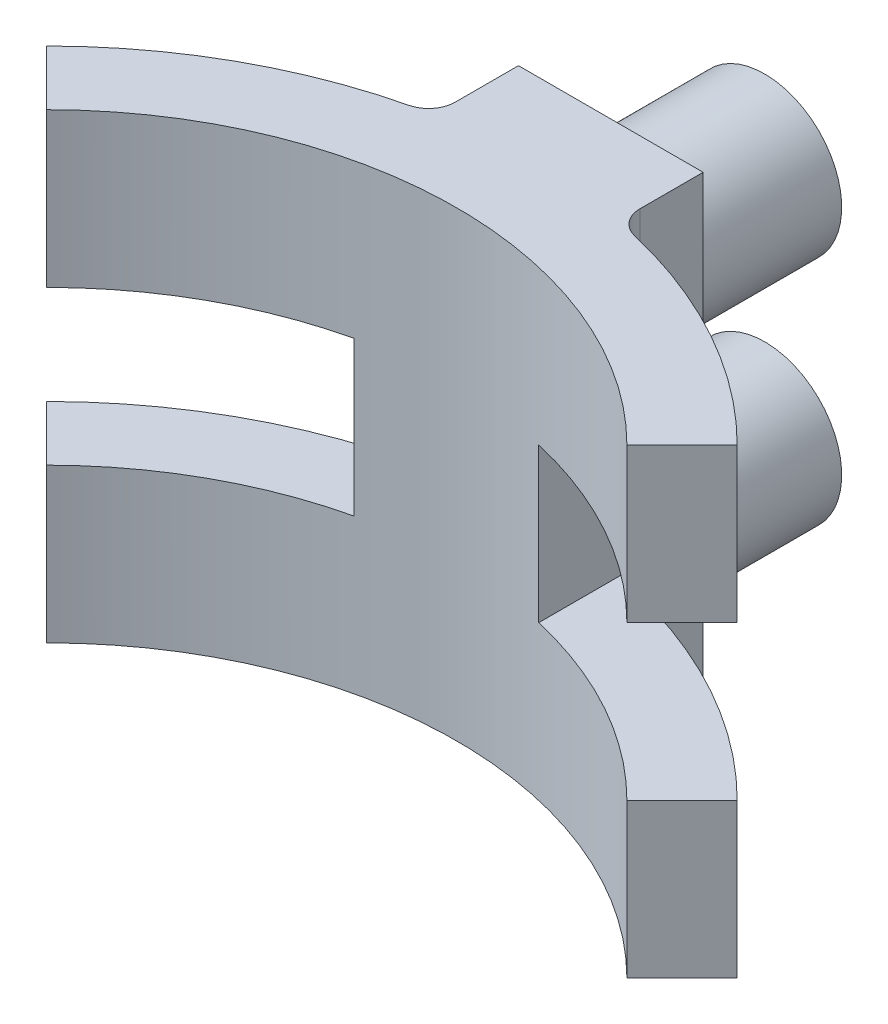
ISO-10303-21;
HEADER;
FILE_DESCRIPTION(('STEP AP214'),'2;1');
FILE_NAME('part.step','',(''),(''),'','','');
FILE_SCHEMA(('AUTOMOTIVE_DESIGN { 1 0 10303 214 1 1 1 1 }'));
ENDSEC;
DATA;
#1=APPLICATION_CONTEXT('core data for automotive mechanical design processes');
#2=APPLICATION_PROTOCOL_DEFINITION('international standard','automotive_design',2000,#1);
#3=PRODUCT_CONTEXT('',#1,'mechanical');
#4=PRODUCT('Part','Part','',(#3));
#5=PRODUCT_RELATED_PRODUCT_CATEGORY('part','',(#4));
#6=PRODUCT_DEFINITION_FORMATION('','',#4);
#7=PRODUCT_DEFINITION_CONTEXT('part definition',#1,'design');
#8=PRODUCT_DEFINITION('design','',#6,#7);
#9=PRODUCT_DEFINITION_SHAPE('','',#8);
#10=(LENGTH_UNIT() NAMED_UNIT(*) SI_UNIT(.MILLI.,.METRE.));
#11=(NAMED_UNIT(*) PLANE_ANGLE_UNIT() SI_UNIT($,.RADIAN.));
#12=(NAMED_UNIT(*) SI_UNIT($,.STERADIAN.) SOLID_ANGLE_UNIT());
#13=UNCERTAINTY_MEASURE_WITH_UNIT(LENGTH_MEASURE(1.E-05),#10,'distance_accuracy_value','');
#14=(GEOMETRIC_REPRESENTATION_CONTEXT(3) GLOBAL_UNCERTAINTY_ASSIGNED_CONTEXT((#13)) GLOBAL_UNIT_ASSIGNED_CONTEXT((#10,
#11,#12)) REPRESENTATION_CONTEXT('',''));
#15=CARTESIAN_POINT('',(0.,0.,0.));
#16=DIRECTION('',(0.,0.,1.));
#17=DIRECTION('',(1.,0.,0.));
#18=AXIS2_PLACEMENT_3D('',#15,#16,#17);
#19=CARTESIAN_POINT('',(0.,75.,0.));
#20=DIRECTION('',(0.,1.,0.));
#21=DIRECTION('',(0.,0.,1.));
#22=AXIS2_PLACEMENT_3D('',#19,#20,#21);
#23=PLANE('',#22);
#24=CARTESIAN_POINT('',(0.,75.,0.));
#25=DIRECTION('',(0.,1.,0.));
#26=DIRECTION('',(0.,0.,1.));
#27=AXIS2_PLACEMENT_3D('',#24,#25,#26);
#28=CIRCLE('',#27,200.);
#29=CARTESIAN_POINT('',(-45.,75.,-194.871752699051));
#30=VERTEX_POINT('',#29);
#31=CARTESIAN_POINT('',(-141.42135623731,75.,-141.421356237309));
#32=VERTEX_POINT('',#31);
#33=EDGE_CURVE('E313',#30,#32,#28,.T.);
#34=ORIENTED_EDGE('',*,*,#33,.F.);
#35=DIRECTION('',(0.,0.,-1.));
#36=VECTOR('',#35,1.);
#37=CARTESIAN_POINT('',(-45.,75.,-141.420356237309));
#38=LINE('',#37,#36);
#39=CARTESIAN_POINT('',(-45.,75.,-244.206879509976));
#40=VERTEX_POINT('',#39);
#41=EDGE_CURVE('E287',#30,#40,#38,.T.);
#42=ORIENTED_EDGE('',*,*,#41,.T.);
#43=CARTESIAN_POINT('',(-58.,75.,-244.206879509976));
#44=DIRECTION('',(0.,1.,0.));
#45=DIRECTION('',(0.,0.,1.));
#46=AXIS2_PLACEMENT_3D('',#43,#44,#45);
#47=CIRCLE('',#46,13.);
#48=CARTESIAN_POINT('',(-54.996015936255,75.,-231.558714435754));
#49=VERTEX_POINT('',#48);
#50=EDGE_CURVE('E302',#40,#49,#47,.F.);
#51=ORIENTED_EDGE('',*,*,#50,.T.);
#52=CARTESIAN_POINT('',(0.,75.,0.));
#53=DIRECTION('',(0.,1.,0.));
#54=DIRECTION('',(0.,0.,1.));
#55=AXIS2_PLACEMENT_3D('',#52,#53,#54);
#56=CIRCLE('',#55,238.);
#57=CARTESIAN_POINT('',(-168.291413922399,75.,-168.291413922398));
#58=VERTEX_POINT('',#57);
#59=EDGE_CURVE('E306',#49,#58,#56,.T.);
#60=ORIENTED_EDGE('',*,*,#59,.T.);
#61=DIRECTION('',(-0.707106781186549,0.,-0.707106781186546));
#62=VECTOR('',#61,1.);
#63=CARTESIAN_POINT('',(1.17756934401283E-13,75.,-1.17756934401283E-13));
#64=LINE('',#63,#62);
#65=EDGE_CURVE('E309',#32,#58,#64,.T.);
#66=ORIENTED_EDGE('',*,*,#65,.F.);
#67=EDGE_LOOP('',(#34,#42,#51,#60,#66));
#68=FACE_BOUND('',#67,.T.);
#69=ADVANCED_FACE('F38',(#68),#23,.T.);
#70=CARTESIAN_POINT('',(58.,75.,-244.206879509976));
#71=DIRECTION('',(0.,-1.,0.));
#72=DIRECTION('',(0.,0.,-1.));
#73=AXIS2_PLACEMENT_3D('',#70,#71,#72);
#74=CYLINDRICAL_SURFACE('',#73,13.);
#75=CARTESIAN_POINT('',(58.,0.,-244.206879509976));
#76=DIRECTION('',(0.,1.,0.));
#77=DIRECTION('',(0.,0.,1.));
#78=AXIS2_PLACEMENT_3D('',#75,#76,#77);
#79=CIRCLE('',#78,13.);
#80=CARTESIAN_POINT('',(45.,0.,-244.206879509976));
#81=VERTEX_POINT('',#80);
#82=CARTESIAN_POINT('',(54.996015936255,0.,-231.558714435754));
#83=VERTEX_POINT('',#82);
#84=EDGE_CURVE('E297',#81,#83,#79,.T.);
#85=ORIENTED_EDGE('',*,*,#84,.F.);
#86=DIRECTION('',(0.,-1.,0.));
#87=VECTOR('',#86,1.);
#88=CARTESIAN_POINT('',(45.,75.,-244.206879509976));
#89=LINE('',#88,#87);
#90=CARTESIAN_POINT('',(45.,75.,-244.206879509976));
#91=VERTEX_POINT('',#90);
#92=EDGE_CURVE('E11',#91,#81,#89,.T.);
#93=ORIENTED_EDGE('',*,*,#92,.F.);
#94=CARTESIAN_POINT('',(58.,75.,-244.206879509976));
#95=DIRECTION('',(0.,1.,0.));
#96=DIRECTION('',(0.,0.,1.));
#97=AXIS2_PLACEMENT_3D('',#94,#95,#96);
#98=CIRCLE('',#97,13.);
#99=CARTESIAN_POINT('',(54.996015936255,75.,-231.558714435754));
#100=VERTEX_POINT('',#99);
#101=EDGE_CURVE('E298',#91,#100,#98,.T.);
#102=ORIENTED_EDGE('',*,*,#101,.T.);
#103=DIRECTION('',(0.,-1.,0.));
#104=VECTOR('',#103,1.);
#105=CARTESIAN_POINT('',(54.996015936255,75.,-231.558714435754));
#106=LINE('',#105,#104);
#107=EDGE_CURVE('E324',#100,#83,#106,.T.);
#108=ORIENTED_EDGE('',*,*,#107,.T.);
#109=EDGE_LOOP('',(#85,#93,#102,#108));
#110=FACE_BOUND('',#109,.T.);
#111=ADVANCED_FACE('F40',(#110),#74,.F.);
#112=CARTESIAN_POINT('',(45.,75.,0.));
#113=DIRECTION('',(-1.,0.,0.));
#114=DIRECTION('',(0.,0.,1.));
#115=AXIS2_PLACEMENT_3D('',#112,#113,#114);
#116=PLANE('',#115);
#117=DIRECTION('',(0.,0.,-1.));
#118=VECTOR('',#117,1.);
#119=CARTESIAN_POINT('',(45.,0.,0.));
#120=LINE('',#119,#118);
#121=CARTESIAN_POINT('',(45.,0.,-275.));
#122=VERTEX_POINT('',#121);
#123=EDGE_CURVE('E328',#81,#122,#120,.T.);
#124=ORIENTED_EDGE('',*,*,#123,.T.);
#125=DIRECTION('',(0.,-1.,0.));
#126=VECTOR('',#125,1.);
#127=CARTESIAN_POINT('',(45.,75.,-275.));
#128=LINE('',#127,#126);
#129=CARTESIAN_POINT('',(45.,225.,-275.));
#130=VERTEX_POINT('',#129);
#131=EDGE_CURVE('E47',#130,#122,#128,.T.);
#132=ORIENTED_EDGE('',*,*,#131,.F.);
#133=DIRECTION('',(0.,0.,-1.));
#134=VECTOR('',#133,1.);
#135=CARTESIAN_POINT('',(45.,225.,-244.206879509976));
#136=LINE('',#135,#134);
#137=CARTESIAN_POINT('',(45.,225.,-244.206879509976));
#138=VERTEX_POINT('',#137);
#139=EDGE_CURVE('E238',#138,#130,#136,.T.);
#140=ORIENTED_EDGE('',*,*,#139,.F.);
#141=DIRECTION('',(0.,1.,0.));
#142=VECTOR('',#141,1.);
#143=CARTESIAN_POINT('',(45.,150.,-244.206879509976));
#144=LINE('',#143,#142);
#145=CARTESIAN_POINT('',(45.,150.,-244.206879509976));
#146=VERTEX_POINT('',#145);
#147=EDGE_CURVE('E276',#146,#138,#144,.T.);
#148=ORIENTED_EDGE('',*,*,#147,.F.);
#149=DIRECTION('',(0.,0.,-1.));
#150=VECTOR('',#149,1.);
#151=CARTESIAN_POINT('',(45.,150.,-141.420356237309));
#152=LINE('',#151,#150);
#153=CARTESIAN_POINT('',(45.,150.,-194.871752699051));
#154=VERTEX_POINT('',#153);
#155=EDGE_CURVE('E54',#154,#146,#152,.T.);
#156=ORIENTED_EDGE('',*,*,#155,.F.);
#157=DIRECTION('',(0.,1.,0.));
#158=VECTOR('',#157,1.);
#159=CARTESIAN_POINT('',(45.,150.,-194.871752699051));
#160=LINE('',#159,#158);
#161=CARTESIAN_POINT('',(45.,75.,-194.871752699051));
#162=VERTEX_POINT('',#161);
#163=EDGE_CURVE('E284',#162,#154,#160,.T.);
#164=ORIENTED_EDGE('',*,*,#163,.F.);
#165=DIRECTION('',(0.,0.,-1.));
#166=VECTOR('',#165,1.);
#167=CARTESIAN_POINT('',(45.,75.,-141.420356237309));
#168=LINE('',#167,#166);
#169=EDGE_CURVE('E290',#162,#91,#168,.T.);
#170=ORIENTED_EDGE('',*,*,#169,.T.);
#171=ORIENTED_EDGE('',*,*,#92,.T.);
#172=EDGE_LOOP('',(#124,#132,#140,#148,#156,#164,#170,#171));
#173=FACE_BOUND('',#172,.T.);
#174=ADVANCED_FACE('F394',(#173),#116,.F.);
#175=CARTESIAN_POINT('',(0.,75.,-275.));
#176=DIRECTION('',(0.,0.,-1.));
#177=DIRECTION('',(-1.,0.,0.));
#178=AXIS2_PLACEMENT_3D('',#175,#176,#177);
#179=PLANE('',#178);
#180=CARTESIAN_POINT('',(0.,56.,-275.));
#181=DIRECTION('',(0.,0.,-1.));
#182=DIRECTION('',(-1.,0.,0.));
#183=AXIS2_PLACEMENT_3D('',#180,#181,#182);
#184=CIRCLE('',#183,37.5);
#185=CARTESIAN_POINT('',(-37.5,56.,-275.));
#186=VERTEX_POINT('',#185);
#187=EDGE_CURVE('E818',#186,#186,#184,.T.);
#188=ORIENTED_EDGE('',*,*,#187,.F.);
#189=EDGE_LOOP('',(#188));
#190=FACE_BOUND('',#189,.T.);
#191=CARTESIAN_POINT('',(0.,169.,-275.));
#192=DIRECTION('',(0.,0.,-1.));
#193=DIRECTION('',(-1.,0.,0.));
#194=AXIS2_PLACEMENT_3D('',#191,#192,#193);
#195=CIRCLE('',#194,37.5);
#196=CARTESIAN_POINT('',(-37.5,169.,-275.));
#197=VERTEX_POINT('',#196);
#198=EDGE_CURVE('E209',#197,#197,#195,.T.);
#199=ORIENTED_EDGE('',*,*,#198,.F.);
#200=EDGE_LOOP('',(#199));
#201=FACE_BOUND('',#200,.T.);
#202=DIRECTION('',(1.,0.,0.));
#203=VECTOR('',#202,1.);
#204=CARTESIAN_POINT('',(0.,0.,-275.));
#205=LINE('',#204,#203);
#206=CARTESIAN_POINT('',(-45.,0.,-275.));
#207=VERTEX_POINT('',#206);
#208=EDGE_CURVE('E332',#207,#122,#205,.T.);
#209=ORIENTED_EDGE('',*,*,#208,.F.);
#210=DIRECTION('',(0.,-1.,0.));
#211=VECTOR('',#210,1.);
#212=CARTESIAN_POINT('',(-45.,75.,-275.));
#213=LINE('',#212,#211);
#214=CARTESIAN_POINT('',(-45.,225.,-275.));
#215=VERTEX_POINT('',#214);
#216=EDGE_CURVE('E383',#215,#207,#213,.T.);
#217=ORIENTED_EDGE('',*,*,#216,.F.);
#218=DIRECTION('',(1.,0.,0.));
#219=VECTOR('',#218,1.);
#220=CARTESIAN_POINT('',(-45.,225.,-275.));
#221=LINE('',#220,#219);
#222=EDGE_CURVE('E242',#215,#130,#221,.T.);
#223=ORIENTED_EDGE('',*,*,#222,.T.);
#224=ORIENTED_EDGE('',*,*,#131,.T.);
#225=EDGE_LOOP('',(#209,#217,#223,#224));
#226=FACE_BOUND('',#225,.T.);
#227=ADVANCED_FACE('F389',(#190,#201,#226),#179,.T.);
#228=CARTESIAN_POINT('',(-45.,75.,0.));
#229=DIRECTION('',(-1.,0.,0.));
#230=DIRECTION('',(0.,0.,1.));
#231=AXIS2_PLACEMENT_3D('',#228,#229,#230);
#232=PLANE('',#231);
#233=DIRECTION('',(0.,0.,-1.));
#234=VECTOR('',#233,1.);
#235=CARTESIAN_POINT('',(-45.,0.,0.));
#236=LINE('',#235,#234);
#237=CARTESIAN_POINT('',(-45.,0.,-244.206879509976));
#238=VERTEX_POINT('',#237);
#239=EDGE_CURVE('E336',#238,#207,#236,.T.);
#240=ORIENTED_EDGE('',*,*,#239,.F.);
#241=DIRECTION('',(0.,-1.,0.));
#242=VECTOR('',#241,1.);
#243=CARTESIAN_POINT('',(-45.,75.,-244.206879509976));
#244=LINE('',#243,#242);
#245=EDGE_CURVE('E380',#40,#238,#244,.T.);
#246=ORIENTED_EDGE('',*,*,#245,.F.);
#247=ORIENTED_EDGE('',*,*,#41,.F.);
#248=DIRECTION('',(0.,1.,0.));
#249=VECTOR('',#248,1.);
#250=CARTESIAN_POINT('',(-45.,150.,-194.871752699051));
#251=LINE('',#250,#249);
#252=CARTESIAN_POINT('',(-45.,150.,-194.871752699051));
#253=VERTEX_POINT('',#252);
#254=EDGE_CURVE('E281',#30,#253,#251,.T.);
#255=ORIENTED_EDGE('',*,*,#254,.T.);
#256=DIRECTION('',(0.,0.,-1.));
#257=VECTOR('',#256,1.);
#258=CARTESIAN_POINT('',(-45.,150.,-141.420356237309));
#259=LINE('',#258,#257);
#260=CARTESIAN_POINT('',(-45.,150.,-244.206879509976));
#261=VERTEX_POINT('',#260);
#262=EDGE_CURVE('E62',#253,#261,#259,.T.);
#263=ORIENTED_EDGE('',*,*,#262,.T.);
#264=DIRECTION('',(0.,1.,0.));
#265=VECTOR('',#264,1.);
#266=CARTESIAN_POINT('',(-45.,150.,-244.206879509976));
#267=LINE('',#266,#265);
#268=CARTESIAN_POINT('',(-45.,225.,-244.206879509976));
#269=VERTEX_POINT('',#268);
#270=EDGE_CURVE('E273',#261,#269,#267,.T.);
#271=ORIENTED_EDGE('',*,*,#270,.T.);
#272=DIRECTION('',(0.,0.,-1.));
#273=VECTOR('',#272,1.);
#274=CARTESIAN_POINT('',(-45.,225.,-244.206879509976));
#275=LINE('',#274,#273);
#276=EDGE_CURVE('E246',#269,#215,#275,.T.);
#277=ORIENTED_EDGE('',*,*,#276,.T.);
#278=ORIENTED_EDGE('',*,*,#216,.T.);
#279=EDGE_LOOP('',(#240,#246,#247,#255,#263,#271,#277,#278));
#280=FACE_BOUND('',#279,.T.);
#281=ADVANCED_FACE('F403',(#280),#232,.T.);
#282=CARTESIAN_POINT('',(-58.,75.,-244.206879509976));
#283=DIRECTION('',(0.,-1.,0.));
#284=DIRECTION('',(0.,0.,-1.));
#285=AXIS2_PLACEMENT_3D('',#282,#283,#284);
#286=CYLINDRICAL_SURFACE('',#285,13.);
#287=CARTESIAN_POINT('',(-58.,0.,-244.206879509976));
#288=DIRECTION('',(0.,1.,0.));
#289=DIRECTION('',(0.,0.,1.));
#290=AXIS2_PLACEMENT_3D('',#287,#288,#289);
#291=CIRCLE('',#290,13.);
#292=CARTESIAN_POINT('',(-54.996015936255,0.,-231.558714435754));
#293=VERTEX_POINT('',#292);
#294=EDGE_CURVE('E340',#238,#293,#291,.F.);
#295=ORIENTED_EDGE('',*,*,#294,.T.);
#296=DIRECTION('',(0.,-1.,0.));
#297=VECTOR('',#296,1.);
#298=CARTESIAN_POINT('',(-54.996015936255,75.,-231.558714435754));
#299=LINE('',#298,#297);
#300=EDGE_CURVE('E376',#49,#293,#299,.T.);
#301=ORIENTED_EDGE('',*,*,#300,.F.);
#302=ORIENTED_EDGE('',*,*,#50,.F.);
#303=ORIENTED_EDGE('',*,*,#245,.T.);
#304=EDGE_LOOP('',(#295,#301,#302,#303));
#305=FACE_BOUND('',#304,.T.);
#306=ADVANCED_FACE('F660',(#305),#286,.F.);
#307=CARTESIAN_POINT('',(0.,75.,0.));
#308=DIRECTION('',(0.,-1.,0.));
#309=DIRECTION('',(0.,0.,-1.));
#310=AXIS2_PLACEMENT_3D('',#307,#308,#309);
#311=CYLINDRICAL_SURFACE('',#310,238.);
#312=CARTESIAN_POINT('',(0.,0.,0.));
#313=DIRECTION('',(0.,1.,0.));
#314=DIRECTION('',(0.,0.,1.));
#315=AXIS2_PLACEMENT_3D('',#312,#313,#314);
#316=CIRCLE('',#315,238.);
#317=CARTESIAN_POINT('',(-168.291413922399,0.,-168.291413922398));
#318=VERTEX_POINT('',#317);
#319=EDGE_CURVE('E343',#293,#318,#316,.T.);
#320=ORIENTED_EDGE('',*,*,#319,.T.);
#321=DIRECTION('',(0.,-1.,0.));
#322=VECTOR('',#321,1.);
#323=CARTESIAN_POINT('',(-168.291413922399,75.,-168.291413922398));
#324=LINE('',#323,#322);
#325=EDGE_CURVE('E373',#58,#318,#324,.T.);
#326=ORIENTED_EDGE('',*,*,#325,.F.);
#327=ORIENTED_EDGE('',*,*,#59,.F.);
#328=ORIENTED_EDGE('',*,*,#300,.T.);
#329=EDGE_LOOP('',(#320,#326,#327,#328));
#330=FACE_BOUND('',#329,.T.);
#331=ADVANCED_FACE('F488',(#330),#311,.T.);
#332=CARTESIAN_POINT('',(1.17756934401283E-13,75.,-1.17756934401283E-13));
#333=DIRECTION('',(-0.707106781186546,0.,0.707106781186549));
#334=DIRECTION('',(0.707106781186549,0.,0.707106781186546));
#335=AXIS2_PLACEMENT_3D('',#332,#333,#334);
#336=PLANE('',#335);
#337=DIRECTION('',(-0.707106781186549,0.,-0.707106781186546));
#338=VECTOR('',#337,1.);
#339=CARTESIAN_POINT('',(1.17756934401283E-13,0.,-1.17756934401283E-13));
#340=LINE('',#339,#338);
#341=CARTESIAN_POINT('',(-141.42135623731,0.,-141.421356237309));
#342=VERTEX_POINT('',#341);
#343=EDGE_CURVE('E347',#342,#318,#340,.T.);
#344=ORIENTED_EDGE('',*,*,#343,.F.);
#345=DIRECTION('',(0.,-1.,0.));
#346=VECTOR('',#345,1.);
#347=CARTESIAN_POINT('',(-141.42135623731,75.,-141.421356237309));
#348=LINE('',#347,#346);
#349=EDGE_CURVE('E370',#32,#342,#348,.T.);
#350=ORIENTED_EDGE('',*,*,#349,.F.);
#351=ORIENTED_EDGE('',*,*,#65,.T.);
#352=ORIENTED_EDGE('',*,*,#325,.T.);
#353=EDGE_LOOP('',(#344,#350,#351,#352));
#354=FACE_BOUND('',#353,.T.);
#355=ADVANCED_FACE('F483',(#354),#336,.T.);
#356=CARTESIAN_POINT('',(0.,75.,0.));
#357=DIRECTION('',(0.,-1.,0.));
#358=DIRECTION('',(0.,0.,-1.));
#359=AXIS2_PLACEMENT_3D('',#356,#357,#358);
#360=CYLINDRICAL_SURFACE('',#359,200.);
#361=CARTESIAN_POINT('',(0.,0.,0.));
#362=DIRECTION('',(0.,1.,0.));
#363=DIRECTION('',(0.,0.,1.));
#364=AXIS2_PLACEMENT_3D('',#361,#362,#363);
#365=CIRCLE('',#364,200.);
#366=CARTESIAN_POINT('',(141.42135623731,0.,-141.421356237309));
#367=VERTEX_POINT('',#366);
#368=EDGE_CURVE('E351',#367,#342,#365,.T.);
#369=ORIENTED_EDGE('',*,*,#368,.F.);
#370=DIRECTION('',(0.,-1.,0.));
#371=VECTOR('',#370,1.);
#372=CARTESIAN_POINT('',(141.42135623731,75.,-141.421356237309));
#373=LINE('',#372,#371);
#374=CARTESIAN_POINT('',(141.42135623731,75.,-141.421356237309));
#375=VERTEX_POINT('',#374);
#376=EDGE_CURVE('E367',#375,#367,#373,.T.);
#377=ORIENTED_EDGE('',*,*,#376,.F.);
#378=EDGE_CURVE('E314',#375,#162,#28,.T.);
#379=ORIENTED_EDGE('',*,*,#378,.T.);
#380=ORIENTED_EDGE('',*,*,#163,.T.);
#381=CARTESIAN_POINT('',(0.,150.,0.));
#382=DIRECTION('',(0.,1.,0.));
#383=DIRECTION('',(0.,0.,1.));
#384=AXIS2_PLACEMENT_3D('',#381,#382,#383);
#385=CIRCLE('',#384,200.);
#386=CARTESIAN_POINT('',(141.42135623731,150.,-141.421356237309));
#387=VERTEX_POINT('',#386);
#388=EDGE_CURVE('E188',#387,#154,#385,.T.);
#389=ORIENTED_EDGE('',*,*,#388,.F.);
#390=DIRECTION('',(0.,1.,0.));
#391=VECTOR('',#390,1.);
#392=CARTESIAN_POINT('',(141.42135623731,150.,-141.421356237309));
#393=LINE('',#392,#391);
#394=CARTESIAN_POINT('',(141.42135623731,225.,-141.421356237309));
#395=VERTEX_POINT('',#394);
#396=EDGE_CURVE('E199',#387,#395,#393,.T.);
#397=ORIENTED_EDGE('',*,*,#396,.T.);
#398=CARTESIAN_POINT('',(0.,225.,0.));
#399=DIRECTION('',(0.,1.,0.));
#400=DIRECTION('',(0.,0.,1.));
#401=AXIS2_PLACEMENT_3D('',#398,#399,#400);
#402=CIRCLE('',#401,200.);
#403=CARTESIAN_POINT('',(-141.42135623731,225.,-141.421356237309));
#404=VERTEX_POINT('',#403);
#405=EDGE_CURVE('E202',#395,#404,#402,.T.);
#406=ORIENTED_EDGE('',*,*,#405,.T.);
#407=DIRECTION('',(0.,1.,0.));
#408=VECTOR('',#407,1.);
#409=CARTESIAN_POINT('',(-141.42135623731,150.,-141.421356237309));
#410=LINE('',#409,#408);
#411=CARTESIAN_POINT('',(-141.42135623731,150.,-141.421356237309));
#412=VERTEX_POINT('',#411);
#413=EDGE_CURVE('E263',#412,#404,#410,.T.);
#414=ORIENTED_EDGE('',*,*,#413,.F.);
#415=EDGE_CURVE('E225',#253,#412,#385,.T.);
#416=ORIENTED_EDGE('',*,*,#415,.F.);
#417=ORIENTED_EDGE('',*,*,#254,.F.);
#418=ORIENTED_EDGE('',*,*,#33,.T.);
#419=ORIENTED_EDGE('',*,*,#349,.T.);
#420=EDGE_LOOP('',(#369,#377,#379,#380,#389,#397,#406,#414,#416,#417,#418,#419));
#421=FACE_BOUND('',#420,.T.);
#422=ADVANCED_FACE('F418',(#421),#360,.F.);
#423=CARTESIAN_POINT('',(-2.25700790935792E-13,75.,-2.25700790935793E-13));
#424=DIRECTION('',(-0.707106781186545,0.,-0.70710678118655));
#425=DIRECTION('',(-0.70710678118655,0.,0.707106781186545));
#426=AXIS2_PLACEMENT_3D('',#423,#424,#425);
#427=PLANE('',#426);
#428=DIRECTION('',(0.70710678118655,0.,-0.707106781186545));
#429=VECTOR('',#428,1.);
#430=CARTESIAN_POINT('',(-2.25700790935792E-13,0.,-2.25700790935793E-13));
#431=LINE('',#430,#429);
#432=CARTESIAN_POINT('',(168.291413922399,0.,-168.291413922398));
#433=VERTEX_POINT('',#432);
#434=EDGE_CURVE('E355',#367,#433,#431,.T.);
#435=ORIENTED_EDGE('',*,*,#434,.T.);
#436=DIRECTION('',(0.,-1.,0.));
#437=VECTOR('',#436,1.);
#438=CARTESIAN_POINT('',(168.291413922399,75.,-168.291413922398));
#439=LINE('',#438,#437);
#440=CARTESIAN_POINT('',(168.291413922399,75.,-168.291413922398));
#441=VERTEX_POINT('',#440);
#442=EDGE_CURVE('E363',#441,#433,#439,.T.);
#443=ORIENTED_EDGE('',*,*,#442,.F.);
#444=DIRECTION('',(0.70710678118655,0.,-0.707106781186545));
#445=VECTOR('',#444,1.);
#446=CARTESIAN_POINT('',(-2.25700790935792E-13,75.,-2.25700790935793E-13));
#447=LINE('',#446,#445);
#448=EDGE_CURVE('E318',#375,#441,#447,.T.);
#449=ORIENTED_EDGE('',*,*,#448,.F.);
#450=ORIENTED_EDGE('',*,*,#376,.T.);
#451=EDGE_LOOP('',(#435,#443,#449,#450));
#452=FACE_BOUND('',#451,.T.);
#453=ADVANCED_FACE('F495',(#452),#427,.F.);
#454=CARTESIAN_POINT('',(0.,75.,0.));
#455=DIRECTION('',(0.,-1.,0.));
#456=DIRECTION('',(0.,0.,-1.));
#457=AXIS2_PLACEMENT_3D('',#454,#455,#456);
#458=CYLINDRICAL_SURFACE('',#457,238.);
#459=CARTESIAN_POINT('',(0.,0.,0.));
#460=DIRECTION('',(0.,1.,0.));
#461=DIRECTION('',(0.,0.,1.));
#462=AXIS2_PLACEMENT_3D('',#459,#460,#461);
#463=CIRCLE('',#462,238.);
#464=EDGE_CURVE('E303',#433,#83,#463,.T.);
#465=ORIENTED_EDGE('',*,*,#464,.T.);
#466=ORIENTED_EDGE('',*,*,#107,.F.);
#467=CARTESIAN_POINT('',(0.,75.,0.));
#468=DIRECTION('',(0.,1.,0.));
#469=DIRECTION('',(0.,0.,1.));
#470=AXIS2_PLACEMENT_3D('',#467,#468,#469);
#471=CIRCLE('',#470,238.);
#472=EDGE_CURVE('E321',#441,#100,#471,.T.);
#473=ORIENTED_EDGE('',*,*,#472,.F.);
#474=ORIENTED_EDGE('',*,*,#442,.T.);
#475=EDGE_LOOP('',(#465,#466,#473,#474));
#476=FACE_BOUND('',#475,.T.);
#477=ADVANCED_FACE('F504',(#476),#458,.T.);
#478=ORIENTED_EDGE('',*,*,#169,.F.);
#479=ORIENTED_EDGE('',*,*,#378,.F.);
#480=ORIENTED_EDGE('',*,*,#448,.T.);
#481=ORIENTED_EDGE('',*,*,#472,.T.);
#482=ORIENTED_EDGE('',*,*,#101,.F.);
#483=EDGE_LOOP('',(#478,#479,#480,#481,#482));
#484=FACE_BOUND('',#483,.T.);
#485=ADVANCED_FACE('F499',(#484),#23,.T.);
#486=CARTESIAN_POINT('',(0.,0.,0.));
#487=DIRECTION('',(0.,1.,0.));
#488=DIRECTION('',(0.,0.,1.));
#489=AXIS2_PLACEMENT_3D('',#486,#487,#488);
#490=PLANE('',#489);
#491=ORIENTED_EDGE('',*,*,#84,.T.);
#492=ORIENTED_EDGE('',*,*,#464,.F.);
#493=ORIENTED_EDGE('',*,*,#434,.F.);
#494=ORIENTED_EDGE('',*,*,#368,.T.);
#495=ORIENTED_EDGE('',*,*,#343,.T.);
#496=ORIENTED_EDGE('',*,*,#319,.F.);
#497=ORIENTED_EDGE('',*,*,#294,.F.);
#498=ORIENTED_EDGE('',*,*,#239,.T.);
#499=ORIENTED_EDGE('',*,*,#208,.T.);
#500=ORIENTED_EDGE('',*,*,#123,.F.);
#501=EDGE_LOOP('',(#491,#492,#493,#494,#495,#496,#497,#498,#499,#500));
#502=FACE_BOUND('',#501,.T.);
#503=ADVANCED_FACE('F398',(#502),#490,.F.);
#504=CARTESIAN_POINT('',(0.,150.,0.));
#505=DIRECTION('',(0.,1.,0.));
#506=DIRECTION('',(0.,0.,1.));
#507=AXIS2_PLACEMENT_3D('',#504,#505,#506);
#508=PLANE('',#507);
#509=ORIENTED_EDGE('',*,*,#262,.F.);
#510=ORIENTED_EDGE('',*,*,#415,.T.);
#511=DIRECTION('',(-0.707106781186549,0.,-0.707106781186546));
#512=VECTOR('',#511,1.);
#513=CARTESIAN_POINT('',(-141.42135623731,150.,-141.421356237309));
#514=LINE('',#513,#512);
#515=CARTESIAN_POINT('',(-168.291413922399,150.,-168.291413922398));
#516=VERTEX_POINT('',#515);
#517=EDGE_CURVE('E222',#412,#516,#514,.T.);
#518=ORIENTED_EDGE('',*,*,#517,.T.);
#519=CARTESIAN_POINT('',(0.,150.,0.));
#520=DIRECTION('',(0.,1.,0.));
#521=DIRECTION('',(0.,0.,1.));
#522=AXIS2_PLACEMENT_3D('',#519,#520,#521);
#523=CIRCLE('',#522,238.);
#524=CARTESIAN_POINT('',(-54.996015936255,150.,-231.558714435754));
#525=VERTEX_POINT('',#524);
#526=EDGE_CURVE('E218',#525,#516,#523,.T.);
#527=ORIENTED_EDGE('',*,*,#526,.F.);
#528=CARTESIAN_POINT('',(-58.,150.,-244.206879509976));
#529=DIRECTION('',(0.,-1.,0.));
#530=DIRECTION('',(0.,0.,-1.));
#531=AXIS2_PLACEMENT_3D('',#528,#529,#530);
#532=CIRCLE('',#531,13.);
#533=EDGE_CURVE('E214',#261,#525,#532,.T.);
#534=ORIENTED_EDGE('',*,*,#533,.F.);
#535=EDGE_LOOP('',(#509,#510,#518,#527,#534));
#536=FACE_BOUND('',#535,.T.);
#537=ADVANCED_FACE('F426',(#536),#508,.F.);
#538=CARTESIAN_POINT('',(141.42135623731,150.,-141.421356237309));
#539=DIRECTION('',(0.707106781186545,0.,0.70710678118655));
#540=DIRECTION('',(0.70710678118655,0.,-0.707106781186545));
#541=AXIS2_PLACEMENT_3D('',#538,#539,#540);
#542=PLANE('',#541);
#543=DIRECTION('',(0.70710678118655,0.,-0.707106781186545));
#544=VECTOR('',#543,1.);
#545=CARTESIAN_POINT('',(141.42135623731,225.,-141.421356237309));
#546=LINE('',#545,#544);
#547=CARTESIAN_POINT('',(168.291413922399,225.,-168.291413922398));
#548=VERTEX_POINT('',#547);
#549=EDGE_CURVE('E228',#395,#548,#546,.T.);
#550=ORIENTED_EDGE('',*,*,#549,.F.);
#551=ORIENTED_EDGE('',*,*,#396,.F.);
#552=DIRECTION('',(0.70710678118655,0.,-0.707106781186545));
#553=VECTOR('',#552,1.);
#554=CARTESIAN_POINT('',(141.42135623731,150.,-141.421356237309));
#555=LINE('',#554,#553);
#556=CARTESIAN_POINT('',(168.291413922399,150.,-168.291413922398));
#557=VERTEX_POINT('',#556);
#558=EDGE_CURVE('E192',#387,#557,#555,.T.);
#559=ORIENTED_EDGE('',*,*,#558,.T.);
#560=DIRECTION('',(0.,1.,0.));
#561=VECTOR('',#560,1.);
#562=CARTESIAN_POINT('',(168.291413922399,150.,-168.291413922398));
#563=LINE('',#562,#561);
#564=EDGE_CURVE('E176',#557,#548,#563,.T.);
#565=ORIENTED_EDGE('',*,*,#564,.T.);
#566=EDGE_LOOP('',(#550,#551,#559,#565));
#567=FACE_BOUND('',#566,.T.);
#568=ADVANCED_FACE('F198',(#567),#542,.T.);
#569=CARTESIAN_POINT('',(-141.42135623731,150.,-141.421356237309));
#570=DIRECTION('',(0.707106781186546,0.,-0.707106781186549));
#571=DIRECTION('',(-0.707106781186549,0.,-0.707106781186546));
#572=AXIS2_PLACEMENT_3D('',#569,#570,#571);
#573=PLANE('',#572);
#574=DIRECTION('',(-0.707106781186549,0.,-0.707106781186546));
#575=VECTOR('',#574,1.);
#576=CARTESIAN_POINT('',(-141.42135623731,225.,-141.421356237309));
#577=LINE('',#576,#575);
#578=CARTESIAN_POINT('',(-168.291413922399,225.,-168.291413922398));
#579=VERTEX_POINT('',#578);
#580=EDGE_CURVE('E206',#404,#579,#577,.T.);
#581=ORIENTED_EDGE('',*,*,#580,.T.);
#582=DIRECTION('',(0.,1.,0.));
#583=VECTOR('',#582,1.);
#584=CARTESIAN_POINT('',(-168.291413922399,150.,-168.291413922398));
#585=LINE('',#584,#583);
#586=EDGE_CURVE('E267',#516,#579,#585,.T.);
#587=ORIENTED_EDGE('',*,*,#586,.F.);
#588=ORIENTED_EDGE('',*,*,#517,.F.);
#589=ORIENTED_EDGE('',*,*,#413,.T.);
#590=EDGE_LOOP('',(#581,#587,#588,#589));
#591=FACE_BOUND('',#590,.T.);
#592=ADVANCED_FACE('F422',(#591),#573,.F.);
#593=CARTESIAN_POINT('',(0.,150.,0.));
#594=DIRECTION('',(0.,1.,0.));
#595=DIRECTION('',(0.,0.,1.));
#596=AXIS2_PLACEMENT_3D('',#593,#594,#595);
#597=CYLINDRICAL_SURFACE('',#596,238.);
#598=CARTESIAN_POINT('',(0.,225.,0.));
#599=DIRECTION('',(0.,1.,0.));
#600=DIRECTION('',(0.,0.,1.));
#601=AXIS2_PLACEMENT_3D('',#598,#599,#600);
#602=CIRCLE('',#601,238.);
#603=CARTESIAN_POINT('',(-54.996015936255,225.,-231.558714435754));
#604=VERTEX_POINT('',#603);
#605=EDGE_CURVE('E254',#604,#579,#602,.T.);
#606=ORIENTED_EDGE('',*,*,#605,.F.);
#607=DIRECTION('',(0.,1.,0.));
#608=VECTOR('',#607,1.);
#609=CARTESIAN_POINT('',(-54.996015936255,150.,-231.558714435754));
#610=LINE('',#609,#608);
#611=EDGE_CURVE('E270',#525,#604,#610,.T.);
#612=ORIENTED_EDGE('',*,*,#611,.F.);
#613=ORIENTED_EDGE('',*,*,#526,.T.);
#614=ORIENTED_EDGE('',*,*,#586,.T.);
#615=EDGE_LOOP('',(#606,#612,#613,#614));
#616=FACE_BOUND('',#615,.T.);
#617=ADVANCED_FACE('F544',(#616),#597,.T.);
#618=CARTESIAN_POINT('',(-58.,150.,-244.206879509976));
#619=DIRECTION('',(0.,1.,0.));
#620=DIRECTION('',(0.,0.,1.));
#621=AXIS2_PLACEMENT_3D('',#618,#619,#620);
#622=CYLINDRICAL_SURFACE('',#621,13.);
#623=CARTESIAN_POINT('',(-58.,225.,-244.206879509976));
#624=DIRECTION('',(0.,-1.,0.));
#625=DIRECTION('',(0.,0.,-1.));
#626=AXIS2_PLACEMENT_3D('',#623,#624,#625);
#627=CIRCLE('',#626,13.);
#628=EDGE_CURVE('E250',#269,#604,#627,.T.);
#629=ORIENTED_EDGE('',*,*,#628,.F.);
#630=ORIENTED_EDGE('',*,*,#270,.F.);
#631=ORIENTED_EDGE('',*,*,#533,.T.);
#632=ORIENTED_EDGE('',*,*,#611,.T.);
#633=EDGE_LOOP('',(#629,#630,#631,#632));
#634=FACE_BOUND('',#633,.T.);
#635=ADVANCED_FACE('F539',(#634),#622,.F.);
#636=CARTESIAN_POINT('',(58.,150.,-244.206879509976));
#637=DIRECTION('',(0.,1.,0.));
#638=DIRECTION('',(0.,0.,1.));
#639=AXIS2_PLACEMENT_3D('',#636,#637,#638);
#640=CYLINDRICAL_SURFACE('',#639,13.);
#641=CARTESIAN_POINT('',(58.,225.,-244.206879509976));
#642=DIRECTION('',(0.,1.,0.));
#643=DIRECTION('',(0.,0.,1.));
#644=AXIS2_PLACEMENT_3D('',#641,#642,#643);
#645=CIRCLE('',#644,13.);
#646=CARTESIAN_POINT('',(54.996015936255,225.,-231.558714435754));
#647=VERTEX_POINT('',#646);
#648=EDGE_CURVE('E234',#138,#647,#645,.T.);
#649=ORIENTED_EDGE('',*,*,#648,.T.);
#650=DIRECTION('',(0.,1.,0.));
#651=VECTOR('',#650,1.);
#652=CARTESIAN_POINT('',(54.996015936255,150.,-231.558714435754));
#653=LINE('',#652,#651);
#654=CARTESIAN_POINT('',(54.996015936255,150.,-231.558714435754));
#655=VERTEX_POINT('',#654);
#656=EDGE_CURVE('E187',#655,#647,#653,.T.);
#657=ORIENTED_EDGE('',*,*,#656,.F.);
#658=CARTESIAN_POINT('',(58.,150.,-244.206879509976));
#659=DIRECTION('',(0.,1.,0.));
#660=DIRECTION('',(0.,0.,1.));
#661=AXIS2_PLACEMENT_3D('',#658,#659,#660);
#662=CIRCLE('',#661,13.);
#663=EDGE_CURVE('E194',#146,#655,#662,.T.);
#664=ORIENTED_EDGE('',*,*,#663,.F.);
#665=ORIENTED_EDGE('',*,*,#147,.T.);
#666=EDGE_LOOP('',(#649,#657,#664,#665));
#667=FACE_BOUND('',#666,.T.);
#668=ADVANCED_FACE('F412',(#667),#640,.F.);
#669=CARTESIAN_POINT('',(0.,150.,0.));
#670=DIRECTION('',(0.,1.,0.));
#671=DIRECTION('',(0.,0.,1.));
#672=AXIS2_PLACEMENT_3D('',#669,#670,#671);
#673=CYLINDRICAL_SURFACE('',#672,238.);
#674=CARTESIAN_POINT('',(0.,225.,0.));
#675=DIRECTION('',(0.,1.,0.));
#676=DIRECTION('',(0.,0.,1.));
#677=AXIS2_PLACEMENT_3D('',#674,#675,#676);
#678=CIRCLE('',#677,238.);
#679=EDGE_CURVE('E181',#548,#647,#678,.T.);
#680=ORIENTED_EDGE('',*,*,#679,.F.);
#681=ORIENTED_EDGE('',*,*,#564,.F.);
#682=CARTESIAN_POINT('',(0.,150.,0.));
#683=DIRECTION('',(0.,1.,0.));
#684=DIRECTION('',(0.,0.,1.));
#685=AXIS2_PLACEMENT_3D('',#682,#683,#684);
#686=CIRCLE('',#685,238.);
#687=EDGE_CURVE('E179',#557,#655,#686,.T.);
#688=ORIENTED_EDGE('',*,*,#687,.T.);
#689=ORIENTED_EDGE('',*,*,#656,.T.);
#690=EDGE_LOOP('',(#680,#681,#688,#689));
#691=FACE_BOUND('',#690,.T.);
#692=ADVANCED_FACE('F178',(#691),#673,.T.);
#693=ORIENTED_EDGE('',*,*,#388,.T.);
#694=ORIENTED_EDGE('',*,*,#155,.T.);
#695=ORIENTED_EDGE('',*,*,#663,.T.);
#696=ORIENTED_EDGE('',*,*,#687,.F.);
#697=ORIENTED_EDGE('',*,*,#558,.F.);
#698=EDGE_LOOP('',(#693,#694,#695,#696,#697));
#699=FACE_BOUND('',#698,.T.);
#700=ADVANCED_FACE('F191',(#699),#508,.F.);
#701=CARTESIAN_POINT('',(0.,225.,0.));
#702=DIRECTION('',(0.,1.,0.));
#703=DIRECTION('',(0.,0.,1.));
#704=AXIS2_PLACEMENT_3D('',#701,#702,#703);
#705=PLANE('',#704);
#706=ORIENTED_EDGE('',*,*,#549,.T.);
#707=ORIENTED_EDGE('',*,*,#679,.T.);
#708=ORIENTED_EDGE('',*,*,#648,.F.);
#709=ORIENTED_EDGE('',*,*,#139,.T.);
#710=ORIENTED_EDGE('',*,*,#222,.F.);
#711=ORIENTED_EDGE('',*,*,#276,.F.);
#712=ORIENTED_EDGE('',*,*,#628,.T.);
#713=ORIENTED_EDGE('',*,*,#605,.T.);
#714=ORIENTED_EDGE('',*,*,#580,.F.);
#715=ORIENTED_EDGE('',*,*,#405,.F.);
#716=EDGE_LOOP('',(#706,#707,#708,#709,#710,#711,#712,#713,#714,#715));
#717=FACE_BOUND('',#716,.T.);
#718=ADVANCED_FACE('F409',(#717),#705,.T.);
#719=CARTESIAN_POINT('',(0.,169.,-350.));
#720=DIRECTION('',(0.,0.,1.));
#721=DIRECTION('',(1.,0.,0.));
#722=AXIS2_PLACEMENT_3D('',#719,#720,#721);
#723=CYLINDRICAL_SURFACE('',#722,37.5);
#724=CARTESIAN_POINT('',(0.,169.,-350.));
#725=DIRECTION('',(0.,0.,-1.));
#726=DIRECTION('',(-1.,0.,0.));
#727=AXIS2_PLACEMENT_3D('',#724,#725,#726);
#728=CIRCLE('',#727,37.5);
#729=CARTESIAN_POINT('',(-37.5,169.,-350.));
#730=VERTEX_POINT('',#729);
#731=EDGE_CURVE('E231',#730,#730,#728,.T.);
#732=ORIENTED_EDGE('',*,*,#731,.F.);
#733=EDGE_LOOP('',(#732));
#734=FACE_BOUND('',#733,.T.);
#735=ORIENTED_EDGE('',*,*,#198,.T.);
#736=EDGE_LOOP('',(#735));
#737=FACE_BOUND('',#736,.T.);
#738=ADVANCED_FACE('F535',(#734,#737),#723,.T.);
#739=CARTESIAN_POINT('',(0.,0.,-350.));
#740=DIRECTION('',(0.,0.,-1.));
#741=DIRECTION('',(-1.,0.,0.));
#742=AXIS2_PLACEMENT_3D('',#739,#740,#741);
#743=PLANE('',#742);
#744=ORIENTED_EDGE('',*,*,#731,.T.);
#745=EDGE_LOOP('',(#744));
#746=FACE_BOUND('',#745,.T.);
#747=ADVANCED_FACE('F590',(#746),#743,.T.);
#748=CARTESIAN_POINT('',(0.,56.,-350.));
#749=DIRECTION('',(0.,0.,1.));
#750=DIRECTION('',(1.,0.,0.));
#751=AXIS2_PLACEMENT_3D('',#748,#749,#750);
#752=CYLINDRICAL_SURFACE('',#751,37.5);
#753=CARTESIAN_POINT('',(0.,56.,-350.));
#754=DIRECTION('',(0.,0.,-1.));
#755=DIRECTION('',(-1.,0.,0.));
#756=AXIS2_PLACEMENT_3D('',#753,#754,#755);
#757=CIRCLE('',#756,37.5);
#758=CARTESIAN_POINT('',(-37.5,56.,-350.));
#759=VERTEX_POINT('',#758);
#760=EDGE_CURVE('E823',#759,#759,#757,.T.);
#761=ORIENTED_EDGE('',*,*,#760,.F.);
#762=EDGE_LOOP('',(#761));
#763=FACE_BOUND('',#762,.T.);
#764=ORIENTED_EDGE('',*,*,#187,.T.);
#765=EDGE_LOOP('',(#764));
#766=FACE_BOUND('',#765,.T.);
#767=ADVANCED_FACE('F599',(#763,#766),#752,.T.);
#768=CARTESIAN_POINT('',(0.,0.,-350.));
#769=DIRECTION('',(0.,0.,-1.));
#770=DIRECTION('',(-1.,0.,0.));
#771=AXIS2_PLACEMENT_3D('',#768,#769,#770);
#772=PLANE('',#771);
#773=ORIENTED_EDGE('',*,*,#760,.T.);
#774=EDGE_LOOP('',(#773));
#775=FACE_BOUND('',#774,.T.);
#776=ADVANCED_FACE('F609',(#775),#772,.T.);
#777=CLOSED_SHELL('',(#69,#111,#174,#227,#281,#306,#331,#355,#422,#453,#477,#485,#503,#537,#568,
#592,#617,#635,#668,#692,#700,#718,#738,#747,#767,#776));
#778=MANIFOLD_SOLID_BREP('B2',#777);
#779=ADVANCED_BREP_SHAPE_REPRESENTATION('',(#18,#778),#14);
#780=SHAPE_DEFINITION_REPRESENTATION(#9,#779);
ENDSEC;
END-ISO-10303-21;
